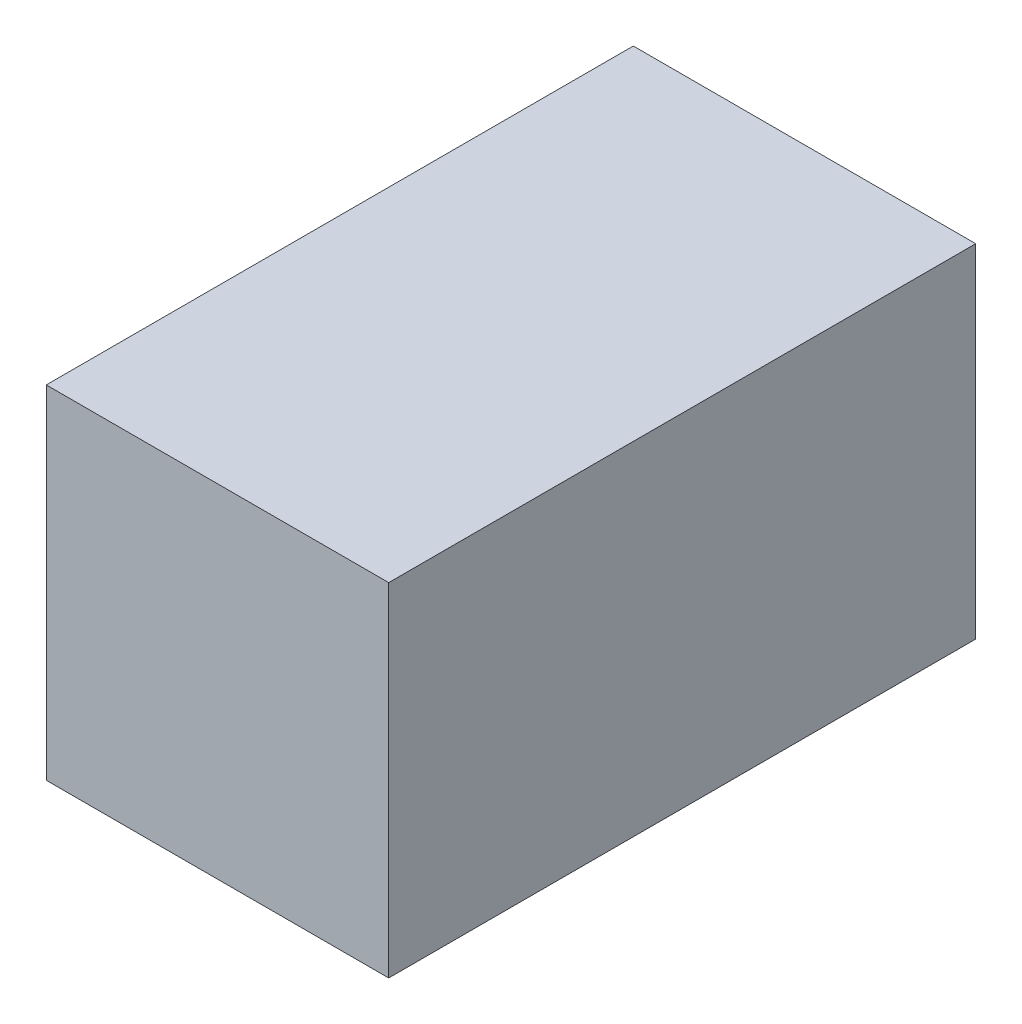
ISO-10303-21;
HEADER;
FILE_DESCRIPTION(('STEP AP214'),'2;1');
FILE_NAME('part.step','',(''),(''),'','','');
FILE_SCHEMA(('AUTOMOTIVE_DESIGN { 1 0 10303 214 1 1 1 1 }'));
ENDSEC;
DATA;
#1=APPLICATION_CONTEXT('core data for automotive mechanical design processes');
#2=APPLICATION_PROTOCOL_DEFINITION('international standard','automotive_design',2000,#1);
#3=PRODUCT_CONTEXT('',#1,'mechanical');
#4=PRODUCT('Part','Part','',(#3));
#5=PRODUCT_RELATED_PRODUCT_CATEGORY('part','',(#4));
#6=PRODUCT_DEFINITION_FORMATION('','',#4);
#7=PRODUCT_DEFINITION_CONTEXT('part definition',#1,'design');
#8=PRODUCT_DEFINITION('design','',#6,#7);
#9=PRODUCT_DEFINITION_SHAPE('','',#8);
#10=(LENGTH_UNIT() NAMED_UNIT(*) SI_UNIT(.MILLI.,.METRE.));
#11=(NAMED_UNIT(*) PLANE_ANGLE_UNIT() SI_UNIT($,.RADIAN.));
#12=(NAMED_UNIT(*) SI_UNIT($,.STERADIAN.) SOLID_ANGLE_UNIT());
#13=UNCERTAINTY_MEASURE_WITH_UNIT(LENGTH_MEASURE(1.E-05),#10,'distance_accuracy_value','');
#14=(GEOMETRIC_REPRESENTATION_CONTEXT(3) GLOBAL_UNCERTAINTY_ASSIGNED_CONTEXT((#13)) GLOBAL_UNIT_ASSIGNED_CONTEXT((#10,
#11,#12)) REPRESENTATION_CONTEXT('',''));
#15=CARTESIAN_POINT('',(0.,0.,0.));
#16=DIRECTION('',(0.,0.,1.));
#17=DIRECTION('',(1.,0.,0.));
#18=AXIS2_PLACEMENT_3D('',#15,#16,#17);
#19=CARTESIAN_POINT('',(-88.9,-88.9,304.8));
#20=DIRECTION('',(1.,0.,0.));
#21=DIRECTION('',(0.,0.,-1.));
#22=AXIS2_PLACEMENT_3D('',#19,#20,#21);
#23=PLANE('',#22);
#24=DIRECTION('',(0.,-1.,0.));
#25=VECTOR('',#24,1.);
#26=CARTESIAN_POINT('',(-88.9,-88.9,0.));
#27=LINE('',#26,#25);
#28=CARTESIAN_POINT('',(-88.9,88.8999999999999,0.));
#29=VERTEX_POINT('',#28);
#30=CARTESIAN_POINT('',(-88.9,-88.9,0.));
#31=VERTEX_POINT('',#30);
#32=EDGE_CURVE('E113',#29,#31,#27,.T.);
#33=ORIENTED_EDGE('',*,*,#32,.T.);
#34=DIRECTION('',(0.,0.,-1.));
#35=VECTOR('',#34,1.);
#36=CARTESIAN_POINT('',(-88.9,-88.9,304.8));
#37=LINE('',#36,#35);
#38=CARTESIAN_POINT('',(-88.9,-88.9,304.8));
#39=VERTEX_POINT('',#38);
#40=EDGE_CURVE('E11',#39,#31,#37,.T.);
#41=ORIENTED_EDGE('',*,*,#40,.F.);
#42=DIRECTION('',(0.,-1.,0.));
#43=VECTOR('',#42,1.);
#44=CARTESIAN_POINT('',(-88.9,-88.9,304.8));
#45=LINE('',#44,#43);
#46=CARTESIAN_POINT('',(-88.9,88.8999999999999,304.8));
#47=VERTEX_POINT('',#46);
#48=EDGE_CURVE('E97',#47,#39,#45,.T.);
#49=ORIENTED_EDGE('',*,*,#48,.F.);
#50=DIRECTION('',(0.,0.,-1.));
#51=VECTOR('',#50,1.);
#52=CARTESIAN_POINT('',(-88.9,88.8999999999999,304.8));
#53=LINE('',#52,#51);
#54=EDGE_CURVE('E109',#47,#29,#53,.T.);
#55=ORIENTED_EDGE('',*,*,#54,.T.);
#56=EDGE_LOOP('',(#33,#41,#49,#55));
#57=FACE_BOUND('',#56,.T.);
#58=ADVANCED_FACE('F45',(#57),#23,.F.);
#59=CARTESIAN_POINT('',(88.9,-88.9,304.8));
#60=DIRECTION('',(0.,1.,0.));
#61=DIRECTION('',(-1.,0.,0.));
#62=AXIS2_PLACEMENT_3D('',#59,#60,#61);
#63=PLANE('',#62);
#64=DIRECTION('',(1.,0.,0.));
#65=VECTOR('',#64,1.);
#66=CARTESIAN_POINT('',(88.9,-88.9,0.));
#67=LINE('',#66,#65);
#68=CARTESIAN_POINT('',(88.9,-88.9,0.));
#69=VERTEX_POINT('',#68);
#70=EDGE_CURVE('E102',#31,#69,#67,.T.);
#71=ORIENTED_EDGE('',*,*,#70,.T.);
#72=DIRECTION('',(0.,0.,-1.));
#73=VECTOR('',#72,1.);
#74=CARTESIAN_POINT('',(88.9,-88.9,304.8));
#75=LINE('',#74,#73);
#76=CARTESIAN_POINT('',(88.9,-88.9,304.8));
#77=VERTEX_POINT('',#76);
#78=EDGE_CURVE('E54',#77,#69,#75,.T.);
#79=ORIENTED_EDGE('',*,*,#78,.F.);
#80=DIRECTION('',(1.,0.,0.));
#81=VECTOR('',#80,1.);
#82=CARTESIAN_POINT('',(88.9,-88.9,304.8));
#83=LINE('',#82,#81);
#84=EDGE_CURVE('E92',#39,#77,#83,.T.);
#85=ORIENTED_EDGE('',*,*,#84,.F.);
#86=ORIENTED_EDGE('',*,*,#40,.T.);
#87=EDGE_LOOP('',(#71,#79,#85,#86));
#88=FACE_BOUND('',#87,.T.);
#89=ADVANCED_FACE('F101',(#88),#63,.F.);
#90=CARTESIAN_POINT('',(88.9,-88.9,304.8));
#91=DIRECTION('',(-1.,0.,0.));
#92=DIRECTION('',(0.,0.,1.));
#93=AXIS2_PLACEMENT_3D('',#90,#91,#92);
#94=PLANE('',#93);
#95=DIRECTION('',(0.,1.,0.));
#96=VECTOR('',#95,1.);
#97=CARTESIAN_POINT('',(88.9,-88.9,0.));
#98=LINE('',#97,#96);
#99=CARTESIAN_POINT('',(88.9,88.9,0.));
#100=VERTEX_POINT('',#99);
#101=EDGE_CURVE('E79',#69,#100,#98,.T.);
#102=ORIENTED_EDGE('',*,*,#101,.T.);
#103=DIRECTION('',(0.,0.,-1.));
#104=VECTOR('',#103,1.);
#105=CARTESIAN_POINT('',(88.9,88.9,304.8));
#106=LINE('',#105,#104);
#107=CARTESIAN_POINT('',(88.9,88.9,304.8));
#108=VERTEX_POINT('',#107);
#109=EDGE_CURVE('E104',#108,#100,#106,.T.);
#110=ORIENTED_EDGE('',*,*,#109,.F.);
#111=DIRECTION('',(0.,1.,0.));
#112=VECTOR('',#111,1.);
#113=CARTESIAN_POINT('',(88.9,-88.9,304.8));
#114=LINE('',#113,#112);
#115=EDGE_CURVE('E95',#77,#108,#114,.T.);
#116=ORIENTED_EDGE('',*,*,#115,.F.);
#117=ORIENTED_EDGE('',*,*,#78,.T.);
#118=EDGE_LOOP('',(#102,#110,#116,#117));
#119=FACE_BOUND('',#118,.T.);
#120=ADVANCED_FACE('F105',(#119),#94,.F.);
#121=CARTESIAN_POINT('',(88.9,88.9,304.8));
#122=DIRECTION('',(0.,-1.,0.));
#123=DIRECTION('',(1.,0.,0.));
#124=AXIS2_PLACEMENT_3D('',#121,#122,#123);
#125=PLANE('',#124);
#126=DIRECTION('',(-1.,0.,0.));
#127=VECTOR('',#126,1.);
#128=CARTESIAN_POINT('',(88.9,88.9,0.));
#129=LINE('',#128,#127);
#130=EDGE_CURVE('E85',#100,#29,#129,.T.);
#131=ORIENTED_EDGE('',*,*,#130,.T.);
#132=ORIENTED_EDGE('',*,*,#54,.F.);
#133=DIRECTION('',(-1.,0.,0.));
#134=VECTOR('',#133,1.);
#135=CARTESIAN_POINT('',(88.9,88.9,304.8));
#136=LINE('',#135,#134);
#137=EDGE_CURVE('E62',#108,#47,#136,.T.);
#138=ORIENTED_EDGE('',*,*,#137,.F.);
#139=ORIENTED_EDGE('',*,*,#109,.T.);
#140=EDGE_LOOP('',(#131,#132,#138,#139));
#141=FACE_BOUND('',#140,.T.);
#142=ADVANCED_FACE('F126',(#141),#125,.F.);
#143=CARTESIAN_POINT('',(0.,0.,304.8));
#144=DIRECTION('',(0.,0.,1.));
#145=DIRECTION('',(1.,0.,0.));
#146=AXIS2_PLACEMENT_3D('',#143,#144,#145);
#147=PLANE('',#146);
#148=ORIENTED_EDGE('',*,*,#48,.T.);
#149=ORIENTED_EDGE('',*,*,#84,.T.);
#150=ORIENTED_EDGE('',*,*,#115,.T.);
#151=ORIENTED_EDGE('',*,*,#137,.T.);
#152=EDGE_LOOP('',(#148,#149,#150,#151));
#153=FACE_BOUND('',#152,.T.);
#154=ADVANCED_FACE('F93',(#153),#147,.T.);
#155=CARTESIAN_POINT('',(0.,0.,0.));
#156=DIRECTION('',(0.,0.,1.));
#157=DIRECTION('',(1.,0.,0.));
#158=AXIS2_PLACEMENT_3D('',#155,#156,#157);
#159=PLANE('',#158);
#160=ORIENTED_EDGE('',*,*,#32,.F.);
#161=ORIENTED_EDGE('',*,*,#130,.F.);
#162=ORIENTED_EDGE('',*,*,#101,.F.);
#163=ORIENTED_EDGE('',*,*,#70,.F.);
#164=EDGE_LOOP('',(#160,#161,#162,#163));
#165=FACE_BOUND('',#164,.T.);
#166=ADVANCED_FACE('F129',(#165),#159,.F.);
#167=CLOSED_SHELL('',(#58,#89,#120,#142,#154,#166));
#168=MANIFOLD_SOLID_BREP('B2',#167);
#169=ADVANCED_BREP_SHAPE_REPRESENTATION('',(#18,#168),#14);
#170=SHAPE_DEFINITION_REPRESENTATION(#9,#169);
ENDSEC;
END-ISO-10303-21;
